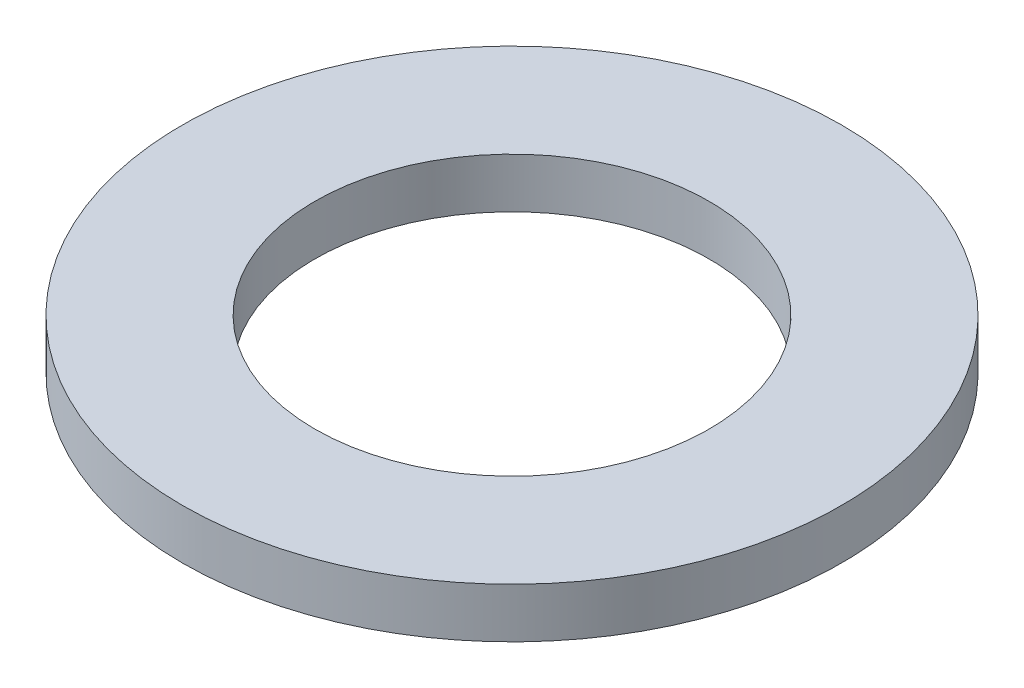
ISO-10303-21;
HEADER;
FILE_DESCRIPTION(('STEP AP214'),'2;1');
FILE_NAME('part.step','',(''),(''),'','','');
FILE_SCHEMA(('AUTOMOTIVE_DESIGN { 1 0 10303 214 1 1 1 1 }'));
ENDSEC;
DATA;
#1=APPLICATION_CONTEXT('core data for automotive mechanical design processes');
#2=APPLICATION_PROTOCOL_DEFINITION('international standard','automotive_design',2000,#1);
#3=PRODUCT_CONTEXT('',#1,'mechanical');
#4=PRODUCT('Part','Part','',(#3));
#5=PRODUCT_RELATED_PRODUCT_CATEGORY('part','',(#4));
#6=PRODUCT_DEFINITION_FORMATION('','',#4);
#7=PRODUCT_DEFINITION_CONTEXT('part definition',#1,'design');
#8=PRODUCT_DEFINITION('design','',#6,#7);
#9=PRODUCT_DEFINITION_SHAPE('','',#8);
#10=(LENGTH_UNIT() NAMED_UNIT(*) SI_UNIT(.MILLI.,.METRE.));
#11=(NAMED_UNIT(*) PLANE_ANGLE_UNIT() SI_UNIT($,.RADIAN.));
#12=(NAMED_UNIT(*) SI_UNIT($,.STERADIAN.) SOLID_ANGLE_UNIT());
#13=UNCERTAINTY_MEASURE_WITH_UNIT(LENGTH_MEASURE(1.E-05),#10,'distance_accuracy_value','');
#14=(GEOMETRIC_REPRESENTATION_CONTEXT(3) GLOBAL_UNCERTAINTY_ASSIGNED_CONTEXT((#13)) GLOBAL_UNIT_ASSIGNED_CONTEXT((#10,
#11,#12)) REPRESENTATION_CONTEXT('',''));
#15=CARTESIAN_POINT('',(0.,0.,0.));
#16=DIRECTION('',(0.,0.,1.));
#17=DIRECTION('',(1.,0.,0.));
#18=AXIS2_PLACEMENT_3D('',#15,#16,#17);
#19=CARTESIAN_POINT('',(0.,0.254,0.));
#20=DIRECTION('',(0.,1.,0.));
#21=DIRECTION('',(0.,0.,1.));
#22=AXIS2_PLACEMENT_3D('',#19,#20,#21);
#23=PLANE('',#22);
#24=CARTESIAN_POINT('',(0.,0.254,0.));
#25=DIRECTION('',(0.,1.,0.));
#26=DIRECTION('',(0.,0.,1.));
#27=AXIS2_PLACEMENT_3D('',#24,#25,#26);
#28=CIRCLE('',#27,1.6764);
#29=CARTESIAN_POINT('',(0.,0.254,1.6764));
#30=VERTEX_POINT('',#29);
#31=EDGE_CURVE('E10',#30,#30,#28,.T.);
#32=ORIENTED_EDGE('',*,*,#31,.T.);
#33=EDGE_LOOP('',(#32));
#34=FACE_BOUND('',#33,.T.);
#35=CARTESIAN_POINT('',(0.,0.254,0.));
#36=DIRECTION('',(0.,1.,0.));
#37=DIRECTION('',(0.,0.,1.));
#38=AXIS2_PLACEMENT_3D('',#35,#36,#37);
#39=CIRCLE('',#38,1.0033);
#40=CARTESIAN_POINT('',(0.,0.254,1.0033));
#41=VERTEX_POINT('',#40);
#42=EDGE_CURVE('E41',#41,#41,#39,.T.);
#43=ORIENTED_EDGE('',*,*,#42,.F.);
#44=EDGE_LOOP('',(#43));
#45=FACE_BOUND('',#44,.T.);
#46=ADVANCED_FACE('F30',(#34,#45),#23,.T.);
#47=CARTESIAN_POINT('',(0.,0.,0.));
#48=DIRECTION('',(0.,1.,0.));
#49=DIRECTION('',(0.,0.,1.));
#50=AXIS2_PLACEMENT_3D('',#47,#48,#49);
#51=PLANE('',#50);
#52=CARTESIAN_POINT('',(0.,0.,0.));
#53=DIRECTION('',(0.,1.,0.));
#54=DIRECTION('',(0.,0.,1.));
#55=AXIS2_PLACEMENT_3D('',#52,#53,#54);
#56=CIRCLE('',#55,1.6764);
#57=CARTESIAN_POINT('',(0.,0.,1.6764));
#58=VERTEX_POINT('',#57);
#59=EDGE_CURVE('E34',#58,#58,#56,.T.);
#60=ORIENTED_EDGE('',*,*,#59,.F.);
#61=EDGE_LOOP('',(#60));
#62=FACE_BOUND('',#61,.T.);
#63=CARTESIAN_POINT('',(0.,0.,0.));
#64=DIRECTION('',(0.,1.,0.));
#65=DIRECTION('',(0.,0.,1.));
#66=AXIS2_PLACEMENT_3D('',#63,#64,#65);
#67=CIRCLE('',#66,1.0033);
#68=CARTESIAN_POINT('',(0.,0.,1.0033));
#69=VERTEX_POINT('',#68);
#70=EDGE_CURVE('E43',#69,#69,#67,.T.);
#71=ORIENTED_EDGE('',*,*,#70,.T.);
#72=EDGE_LOOP('',(#71));
#73=FACE_BOUND('',#72,.T.);
#74=ADVANCED_FACE('F53',(#62,#73),#51,.F.);
#75=CARTESIAN_POINT('',(0.,0.254,0.));
#76=DIRECTION('',(0.,-1.,0.));
#77=DIRECTION('',(0.,0.,-1.));
#78=AXIS2_PLACEMENT_3D('',#75,#76,#77);
#79=CYLINDRICAL_SURFACE('',#78,1.6764);
#80=ORIENTED_EDGE('',*,*,#31,.F.);
#81=EDGE_LOOP('',(#80));
#82=FACE_BOUND('',#81,.T.);
#83=ORIENTED_EDGE('',*,*,#59,.T.);
#84=EDGE_LOOP('',(#83));
#85=FACE_BOUND('',#84,.T.);
#86=ADVANCED_FACE('F32',(#82,#85),#79,.T.);
#87=CARTESIAN_POINT('',(0.,0.254,0.));
#88=DIRECTION('',(0.,-1.,0.));
#89=DIRECTION('',(0.,0.,-1.));
#90=AXIS2_PLACEMENT_3D('',#87,#88,#89);
#91=CYLINDRICAL_SURFACE('',#90,1.0033);
#92=ORIENTED_EDGE('',*,*,#42,.T.);
#93=EDGE_LOOP('',(#92));
#94=FACE_BOUND('',#93,.T.);
#95=ORIENTED_EDGE('',*,*,#70,.F.);
#96=EDGE_LOOP('',(#95));
#97=FACE_BOUND('',#96,.T.);
#98=ADVANCED_FACE('F49',(#94,#97),#91,.F.);
#99=CLOSED_SHELL('',(#46,#74,#86,#98));
#100=MANIFOLD_SOLID_BREP('B2',#99);
#101=ADVANCED_BREP_SHAPE_REPRESENTATION('',(#18,#100),#14);
#102=SHAPE_DEFINITION_REPRESENTATION(#9,#101);
ENDSEC;
END-ISO-10303-21;
